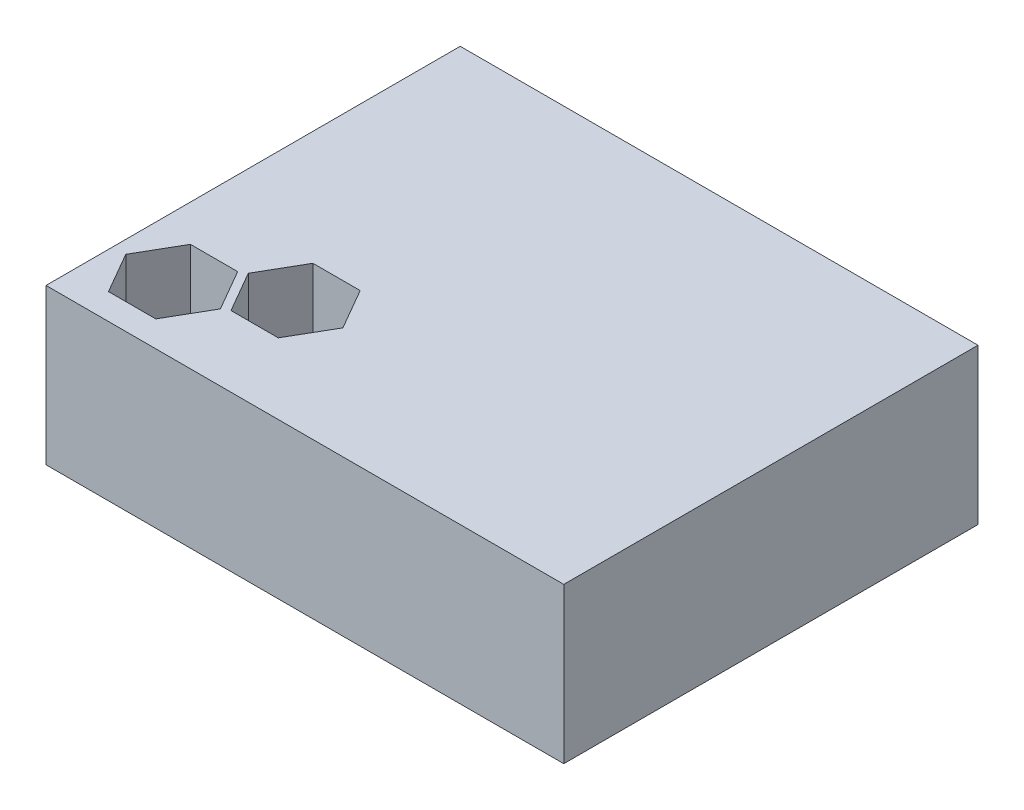
ISO-10303-21;
HEADER;
FILE_DESCRIPTION(('STEP AP214'),'2;1');
FILE_NAME('part.step','',(''),(''),'','','');
FILE_SCHEMA(('AUTOMOTIVE_DESIGN { 1 0 10303 214 1 1 1 1 }'));
ENDSEC;
DATA;
#1=APPLICATION_CONTEXT('core data for automotive mechanical design processes');
#2=APPLICATION_PROTOCOL_DEFINITION('international standard','automotive_design',2000,#1);
#3=PRODUCT_CONTEXT('',#1,'mechanical');
#4=PRODUCT('Part','Part','',(#3));
#5=PRODUCT_RELATED_PRODUCT_CATEGORY('part','',(#4));
#6=PRODUCT_DEFINITION_FORMATION('','',#4);
#7=PRODUCT_DEFINITION_CONTEXT('part definition',#1,'design');
#8=PRODUCT_DEFINITION('design','',#6,#7);
#9=PRODUCT_DEFINITION_SHAPE('','',#8);
#10=(LENGTH_UNIT() NAMED_UNIT(*) SI_UNIT(.MILLI.,.METRE.));
#11=(NAMED_UNIT(*) PLANE_ANGLE_UNIT() SI_UNIT($,.RADIAN.));
#12=(NAMED_UNIT(*) SI_UNIT($,.STERADIAN.) SOLID_ANGLE_UNIT());
#13=UNCERTAINTY_MEASURE_WITH_UNIT(LENGTH_MEASURE(1.E-05),#10,'distance_accuracy_value','');
#14=(GEOMETRIC_REPRESENTATION_CONTEXT(3) GLOBAL_UNCERTAINTY_ASSIGNED_CONTEXT((#13)) GLOBAL_UNIT_ASSIGNED_CONTEXT((#10,
#11,#12)) REPRESENTATION_CONTEXT('',''));
#15=CARTESIAN_POINT('',(0.,0.,0.));
#16=DIRECTION('',(0.,0.,1.));
#17=DIRECTION('',(1.,0.,0.));
#18=AXIS2_PLACEMENT_3D('',#15,#16,#17);
#19=CARTESIAN_POINT('',(0.,3.,0.));
#20=DIRECTION('',(1.,0.,0.));
#21=DIRECTION('',(0.,0.,-1.));
#22=AXIS2_PLACEMENT_3D('',#19,#20,#21);
#23=PLANE('',#22);
#24=DIRECTION('',(0.,0.,1.));
#25=VECTOR('',#24,1.);
#26=CARTESIAN_POINT('',(0.,0.,0.));
#27=LINE('',#26,#25);
#28=CARTESIAN_POINT('',(0.,0.,-8.));
#29=VERTEX_POINT('',#28);
#30=CARTESIAN_POINT('',(0.,0.,0.));
#31=VERTEX_POINT('',#30);
#32=EDGE_CURVE('E239',#29,#31,#27,.T.);
#33=ORIENTED_EDGE('',*,*,#32,.T.);
#34=DIRECTION('',(0.,-1.,0.));
#35=VECTOR('',#34,1.);
#36=CARTESIAN_POINT('',(0.,3.,0.));
#37=LINE('',#36,#35);
#38=CARTESIAN_POINT('',(0.,3.,0.));
#39=VERTEX_POINT('',#38);
#40=EDGE_CURVE('E11',#39,#31,#37,.T.);
#41=ORIENTED_EDGE('',*,*,#40,.F.);
#42=DIRECTION('',(0.,0.,1.));
#43=VECTOR('',#42,1.);
#44=CARTESIAN_POINT('',(0.,3.,0.));
#45=LINE('',#44,#43);
#46=CARTESIAN_POINT('',(0.,3.,-8.));
#47=VERTEX_POINT('',#46);
#48=EDGE_CURVE('E240',#47,#39,#45,.T.);
#49=ORIENTED_EDGE('',*,*,#48,.F.);
#50=DIRECTION('',(0.,-1.,0.));
#51=VECTOR('',#50,1.);
#52=CARTESIAN_POINT('',(0.,3.,-8.));
#53=LINE('',#52,#51);
#54=EDGE_CURVE('E250',#47,#29,#53,.T.);
#55=ORIENTED_EDGE('',*,*,#54,.T.);
#56=EDGE_LOOP('',(#33,#41,#49,#55));
#57=FACE_BOUND('',#56,.T.);
#58=ADVANCED_FACE('F34',(#57),#23,.F.);
#59=CARTESIAN_POINT('',(0.,3.,0.));
#60=DIRECTION('',(0.,0.,-1.));
#61=DIRECTION('',(-1.,0.,0.));
#62=AXIS2_PLACEMENT_3D('',#59,#60,#61);
#63=PLANE('',#62);
#64=DIRECTION('',(1.,0.,0.));
#65=VECTOR('',#64,1.);
#66=CARTESIAN_POINT('',(0.,0.,0.));
#67=LINE('',#66,#65);
#68=CARTESIAN_POINT('',(10.,0.,0.));
#69=VERTEX_POINT('',#68);
#70=EDGE_CURVE('E253',#31,#69,#67,.T.);
#71=ORIENTED_EDGE('',*,*,#70,.T.);
#72=DIRECTION('',(0.,-1.,0.));
#73=VECTOR('',#72,1.);
#74=CARTESIAN_POINT('',(10.,3.,0.));
#75=LINE('',#74,#73);
#76=CARTESIAN_POINT('',(10.,3.,0.));
#77=VERTEX_POINT('',#76);
#78=EDGE_CURVE('E41',#77,#69,#75,.T.);
#79=ORIENTED_EDGE('',*,*,#78,.F.);
#80=DIRECTION('',(1.,0.,0.));
#81=VECTOR('',#80,1.);
#82=CARTESIAN_POINT('',(0.,3.,0.));
#83=LINE('',#82,#81);
#84=EDGE_CURVE('E243',#39,#77,#83,.T.);
#85=ORIENTED_EDGE('',*,*,#84,.F.);
#86=ORIENTED_EDGE('',*,*,#40,.T.);
#87=EDGE_LOOP('',(#71,#79,#85,#86));
#88=FACE_BOUND('',#87,.T.);
#89=ADVANCED_FACE('F282',(#88),#63,.F.);
#90=CARTESIAN_POINT('',(10.,3.,0.));
#91=DIRECTION('',(-1.,0.,0.));
#92=DIRECTION('',(0.,0.,1.));
#93=AXIS2_PLACEMENT_3D('',#90,#91,#92);
#94=PLANE('',#93);
#95=DIRECTION('',(0.,0.,-1.));
#96=VECTOR('',#95,1.);
#97=CARTESIAN_POINT('',(10.,0.,0.));
#98=LINE('',#97,#96);
#99=CARTESIAN_POINT('',(10.,0.,-8.));
#100=VERTEX_POINT('',#99);
#101=EDGE_CURVE('E255',#69,#100,#98,.T.);
#102=ORIENTED_EDGE('',*,*,#101,.T.);
#103=DIRECTION('',(0.,-1.,0.));
#104=VECTOR('',#103,1.);
#105=CARTESIAN_POINT('',(10.,3.,-8.));
#106=LINE('',#105,#104);
#107=CARTESIAN_POINT('',(10.,3.,-8.));
#108=VERTEX_POINT('',#107);
#109=EDGE_CURVE('E260',#108,#100,#106,.T.);
#110=ORIENTED_EDGE('',*,*,#109,.F.);
#111=DIRECTION('',(0.,0.,-1.));
#112=VECTOR('',#111,1.);
#113=CARTESIAN_POINT('',(10.,3.,0.));
#114=LINE('',#113,#112);
#115=EDGE_CURVE('E246',#77,#108,#114,.T.);
#116=ORIENTED_EDGE('',*,*,#115,.F.);
#117=ORIENTED_EDGE('',*,*,#78,.T.);
#118=EDGE_LOOP('',(#102,#110,#116,#117));
#119=FACE_BOUND('',#118,.T.);
#120=ADVANCED_FACE('F267',(#119),#94,.F.);
#121=CARTESIAN_POINT('',(0.,3.,-8.));
#122=DIRECTION('',(0.,0.,1.));
#123=DIRECTION('',(1.,0.,0.));
#124=AXIS2_PLACEMENT_3D('',#121,#122,#123);
#125=PLANE('',#124);
#126=DIRECTION('',(-1.,0.,0.));
#127=VECTOR('',#126,1.);
#128=CARTESIAN_POINT('',(0.,0.,-8.));
#129=LINE('',#128,#127);
#130=EDGE_CURVE('E244',#100,#29,#129,.T.);
#131=ORIENTED_EDGE('',*,*,#130,.T.);
#132=ORIENTED_EDGE('',*,*,#54,.F.);
#133=DIRECTION('',(-1.,0.,0.));
#134=VECTOR('',#133,1.);
#135=CARTESIAN_POINT('',(0.,3.,-8.));
#136=LINE('',#135,#134);
#137=EDGE_CURVE('E248',#108,#47,#136,.T.);
#138=ORIENTED_EDGE('',*,*,#137,.F.);
#139=ORIENTED_EDGE('',*,*,#109,.T.);
#140=EDGE_LOOP('',(#131,#132,#138,#139));
#141=FACE_BOUND('',#140,.T.);
#142=ADVANCED_FACE('F275',(#141),#125,.F.);
#143=CARTESIAN_POINT('',(0.,3.,0.));
#144=DIRECTION('',(0.,-1.,0.));
#145=DIRECTION('',(0.,0.,-1.));
#146=AXIS2_PLACEMENT_3D('',#143,#144,#145);
#147=PLANE('',#146);
#148=DIRECTION('',(-0.5,0.,-0.866025403784439));
#149=VECTOR('',#148,1.);
#150=CARTESIAN_POINT('',(3.57679491924311,3.,-2.15705080756886));
#151=LINE('',#150,#149);
#152=CARTESIAN_POINT('',(3.57679491924311,3.,-2.15705080756886));
#153=VERTEX_POINT('',#152);
#154=CARTESIAN_POINT('',(3.12009618943233,3.,-2.9480762113533));
#155=VERTEX_POINT('',#154);
#156=EDGE_CURVE('E166',#153,#155,#151,.T.);
#157=ORIENTED_EDGE('',*,*,#156,.F.);
#158=DIRECTION('',(0.5,0.,-0.866025403784439));
#159=VECTOR('',#158,1.);
#160=CARTESIAN_POINT('',(3.12009618943233,3.,-1.36602540378443));
#161=LINE('',#160,#159);
#162=CARTESIAN_POINT('',(3.12009618943233,3.,-1.36602540378443));
#163=VERTEX_POINT('',#162);
#164=EDGE_CURVE('E48',#163,#153,#161,.T.);
#165=ORIENTED_EDGE('',*,*,#164,.F.);
#166=DIRECTION('',(1.,0.,0.));
#167=VECTOR('',#166,1.);
#168=CARTESIAN_POINT('',(2.20669872981078,3.,-1.36602540378443));
#169=LINE('',#168,#167);
#170=CARTESIAN_POINT('',(2.20669872981078,3.,-1.36602540378443));
#171=VERTEX_POINT('',#170);
#172=EDGE_CURVE('E158',#171,#163,#169,.T.);
#173=ORIENTED_EDGE('',*,*,#172,.F.);
#174=DIRECTION('',(0.5,0.,0.866025403784439));
#175=VECTOR('',#174,1.);
#176=CARTESIAN_POINT('',(1.75,3.,-2.15705080756886));
#177=LINE('',#176,#175);
#178=CARTESIAN_POINT('',(1.75,3.,-2.15705080756886));
#179=VERTEX_POINT('',#178);
#180=EDGE_CURVE('E179',#179,#171,#177,.T.);
#181=ORIENTED_EDGE('',*,*,#180,.F.);
#182=DIRECTION('',(-0.5,0.,0.866025403784439));
#183=VECTOR('',#182,1.);
#184=CARTESIAN_POINT('',(2.20669872981078,3.,-2.9480762113533));
#185=LINE('',#184,#183);
#186=CARTESIAN_POINT('',(2.20669872981078,3.,-2.9480762113533));
#187=VERTEX_POINT('',#186);
#188=EDGE_CURVE('E176',#187,#179,#185,.T.);
#189=ORIENTED_EDGE('',*,*,#188,.F.);
#190=DIRECTION('',(-1.,0.,0.));
#191=VECTOR('',#190,1.);
#192=CARTESIAN_POINT('',(3.12009618943233,3.,-2.9480762113533));
#193=LINE('',#192,#191);
#194=EDGE_CURVE('E173',#155,#187,#193,.T.);
#195=ORIENTED_EDGE('',*,*,#194,.F.);
#196=EDGE_LOOP('',(#157,#165,#173,#181,#189,#195));
#197=FACE_BOUND('',#196,.T.);
#198=DIRECTION('',(-0.5,0.,-0.866025403784439));
#199=VECTOR('',#198,1.);
#200=CARTESIAN_POINT('',(2.07679491924311,3.,-1.29102540378444));
#201=LINE('',#200,#199);
#202=CARTESIAN_POINT('',(2.07679491924311,3.,-1.29102540378444));
#203=VERTEX_POINT('',#202);
#204=CARTESIAN_POINT('',(1.62009618943233,3.,-2.08205080756887));
#205=VERTEX_POINT('',#204);
#206=EDGE_CURVE('E208',#203,#205,#201,.T.);
#207=ORIENTED_EDGE('',*,*,#206,.F.);
#208=DIRECTION('',(0.5,0.,-0.866025403784439));
#209=VECTOR('',#208,1.);
#210=CARTESIAN_POINT('',(1.62009618943233,3.,-0.5));
#211=LINE('',#210,#209);
#212=CARTESIAN_POINT('',(1.62009618943233,3.,-0.5));
#213=VERTEX_POINT('',#212);
#214=EDGE_CURVE('E206',#213,#203,#211,.T.);
#215=ORIENTED_EDGE('',*,*,#214,.F.);
#216=DIRECTION('',(1.,0.,0.));
#217=VECTOR('',#216,1.);
#218=CARTESIAN_POINT('',(0.706698729810776,3.,-0.5));
#219=LINE('',#218,#217);
#220=CARTESIAN_POINT('',(0.706698729810776,3.,-0.5));
#221=VERTEX_POINT('',#220);
#222=EDGE_CURVE('E220',#221,#213,#219,.T.);
#223=ORIENTED_EDGE('',*,*,#222,.F.);
#224=DIRECTION('',(0.5,0.,0.866025403784439));
#225=VECTOR('',#224,1.);
#226=CARTESIAN_POINT('',(0.25,3.,-1.29102540378444));
#227=LINE('',#226,#225);
#228=CARTESIAN_POINT('',(0.25,3.,-1.29102540378444));
#229=VERTEX_POINT('',#228);
#230=EDGE_CURVE('E217',#229,#221,#227,.T.);
#231=ORIENTED_EDGE('',*,*,#230,.F.);
#232=DIRECTION('',(-0.5,0.,0.866025403784439));
#233=VECTOR('',#232,1.);
#234=CARTESIAN_POINT('',(0.706698729810777,3.,-2.08205080756887));
#235=LINE('',#234,#233);
#236=CARTESIAN_POINT('',(0.706698729810777,3.,-2.08205080756887));
#237=VERTEX_POINT('',#236);
#238=EDGE_CURVE('E214',#237,#229,#235,.T.);
#239=ORIENTED_EDGE('',*,*,#238,.F.);
#240=DIRECTION('',(-1.,0.,0.));
#241=VECTOR('',#240,1.);
#242=CARTESIAN_POINT('',(1.62009618943233,3.,-2.08205080756887));
#243=LINE('',#242,#241);
#244=EDGE_CURVE('E211',#205,#237,#243,.T.);
#245=ORIENTED_EDGE('',*,*,#244,.F.);
#246=EDGE_LOOP('',(#207,#215,#223,#231,#239,#245));
#247=FACE_BOUND('',#246,.T.);
#248=ORIENTED_EDGE('',*,*,#48,.T.);
#249=ORIENTED_EDGE('',*,*,#84,.T.);
#250=ORIENTED_EDGE('',*,*,#115,.T.);
#251=ORIENTED_EDGE('',*,*,#137,.T.);
#252=EDGE_LOOP('',(#248,#249,#250,#251));
#253=FACE_BOUND('',#252,.T.);
#254=ADVANCED_FACE('F281',(#197,#247,#253),#147,.F.);
#255=CARTESIAN_POINT('',(0.,0.,0.));
#256=DIRECTION('',(0.,-1.,0.));
#257=DIRECTION('',(0.,0.,-1.));
#258=AXIS2_PLACEMENT_3D('',#255,#256,#257);
#259=PLANE('',#258);
#260=DIRECTION('',(0.5,0.,-0.866025403784439));
#261=VECTOR('',#260,1.);
#262=CARTESIAN_POINT('',(3.12009618943233,0.,-1.36602540378443));
#263=LINE('',#262,#261);
#264=CARTESIAN_POINT('',(3.12009618943233,0.,-1.36602540378443));
#265=VERTEX_POINT('',#264);
#266=CARTESIAN_POINT('',(3.57679491924311,0.,-2.15705080756886));
#267=VERTEX_POINT('',#266);
#268=EDGE_CURVE('E156',#265,#267,#263,.T.);
#269=ORIENTED_EDGE('',*,*,#268,.T.);
#270=DIRECTION('',(-0.5,0.,-0.866025403784439));
#271=VECTOR('',#270,1.);
#272=CARTESIAN_POINT('',(3.57679491924311,0.,-2.15705080756886));
#273=LINE('',#272,#271);
#274=CARTESIAN_POINT('',(3.12009618943233,0.,-2.9480762113533));
#275=VERTEX_POINT('',#274);
#276=EDGE_CURVE('E145',#267,#275,#273,.T.);
#277=ORIENTED_EDGE('',*,*,#276,.T.);
#278=DIRECTION('',(-1.,0.,0.));
#279=VECTOR('',#278,1.);
#280=CARTESIAN_POINT('',(3.12009618943233,0.,-2.9480762113533));
#281=LINE('',#280,#279);
#282=CARTESIAN_POINT('',(2.20669872981078,0.,-2.9480762113533));
#283=VERTEX_POINT('',#282);
#284=EDGE_CURVE('E350',#275,#283,#281,.T.);
#285=ORIENTED_EDGE('',*,*,#284,.T.);
#286=DIRECTION('',(-0.5,0.,0.866025403784439));
#287=VECTOR('',#286,1.);
#288=CARTESIAN_POINT('',(2.20669872981078,0.,-2.9480762113533));
#289=LINE('',#288,#287);
#290=CARTESIAN_POINT('',(1.75,0.,-2.15705080756886));
#291=VERTEX_POINT('',#290);
#292=EDGE_CURVE('E352',#283,#291,#289,.T.);
#293=ORIENTED_EDGE('',*,*,#292,.T.);
#294=DIRECTION('',(0.5,0.,0.866025403784439));
#295=VECTOR('',#294,1.);
#296=CARTESIAN_POINT('',(1.75,0.,-2.15705080756886));
#297=LINE('',#296,#295);
#298=CARTESIAN_POINT('',(2.20669872981078,0.,-1.36602540378443));
#299=VERTEX_POINT('',#298);
#300=EDGE_CURVE('E168',#291,#299,#297,.T.);
#301=ORIENTED_EDGE('',*,*,#300,.T.);
#302=DIRECTION('',(1.,0.,0.));
#303=VECTOR('',#302,1.);
#304=CARTESIAN_POINT('',(2.20669872981078,0.,-1.36602540378443));
#305=LINE('',#304,#303);
#306=EDGE_CURVE('E164',#299,#265,#305,.T.);
#307=ORIENTED_EDGE('',*,*,#306,.T.);
#308=EDGE_LOOP('',(#269,#277,#285,#293,#301,#307));
#309=FACE_BOUND('',#308,.T.);
#310=DIRECTION('',(0.5,0.,-0.866025403784439));
#311=VECTOR('',#310,1.);
#312=CARTESIAN_POINT('',(1.62009618943233,0.,-0.5));
#313=LINE('',#312,#311);
#314=CARTESIAN_POINT('',(1.62009618943233,0.,-0.5));
#315=VERTEX_POINT('',#314);
#316=CARTESIAN_POINT('',(2.07679491924311,0.,-1.29102540378444));
#317=VERTEX_POINT('',#316);
#318=EDGE_CURVE('E203',#315,#317,#313,.T.);
#319=ORIENTED_EDGE('',*,*,#318,.T.);
#320=DIRECTION('',(-0.5,0.,-0.866025403784439));
#321=VECTOR('',#320,1.);
#322=CARTESIAN_POINT('',(2.07679491924311,0.,-1.29102540378444));
#323=LINE('',#322,#321);
#324=CARTESIAN_POINT('',(1.62009618943233,0.,-2.08205080756887));
#325=VERTEX_POINT('',#324);
#326=EDGE_CURVE('E226',#317,#325,#323,.T.);
#327=ORIENTED_EDGE('',*,*,#326,.T.);
#328=DIRECTION('',(-1.,0.,0.));
#329=VECTOR('',#328,1.);
#330=CARTESIAN_POINT('',(1.62009618943233,0.,-2.08205080756887));
#331=LINE('',#330,#329);
#332=CARTESIAN_POINT('',(0.706698729810777,0.,-2.08205080756887));
#333=VERTEX_POINT('',#332);
#334=EDGE_CURVE('E152',#325,#333,#331,.T.);
#335=ORIENTED_EDGE('',*,*,#334,.T.);
#336=DIRECTION('',(-0.5,0.,0.866025403784439));
#337=VECTOR('',#336,1.);
#338=CARTESIAN_POINT('',(0.706698729810777,0.,-2.08205080756887));
#339=LINE('',#338,#337);
#340=CARTESIAN_POINT('',(0.25,0.,-1.29102540378444));
#341=VERTEX_POINT('',#340);
#342=EDGE_CURVE('E194',#333,#341,#339,.T.);
#343=ORIENTED_EDGE('',*,*,#342,.T.);
#344=DIRECTION('',(0.5,0.,0.866025403784439));
#345=VECTOR('',#344,1.);
#346=CARTESIAN_POINT('',(0.25,0.,-1.29102540378444));
#347=LINE('',#346,#345);
#348=CARTESIAN_POINT('',(0.706698729810776,0.,-0.5));
#349=VERTEX_POINT('',#348);
#350=EDGE_CURVE('E197',#341,#349,#347,.T.);
#351=ORIENTED_EDGE('',*,*,#350,.T.);
#352=DIRECTION('',(1.,0.,0.));
#353=VECTOR('',#352,1.);
#354=CARTESIAN_POINT('',(0.706698729810776,0.,-0.5));
#355=LINE('',#354,#353);
#356=EDGE_CURVE('E200',#349,#315,#355,.T.);
#357=ORIENTED_EDGE('',*,*,#356,.T.);
#358=EDGE_LOOP('',(#319,#327,#335,#343,#351,#357));
#359=FACE_BOUND('',#358,.T.);
#360=ORIENTED_EDGE('',*,*,#32,.F.);
#361=ORIENTED_EDGE('',*,*,#130,.F.);
#362=ORIENTED_EDGE('',*,*,#101,.F.);
#363=ORIENTED_EDGE('',*,*,#70,.F.);
#364=EDGE_LOOP('',(#360,#361,#362,#363));
#365=FACE_BOUND('',#364,.T.);
#366=ADVANCED_FACE('F161',(#309,#359,#365),#259,.T.);
#367=CARTESIAN_POINT('',(1.62009618943233,-0.00100000000000013,-0.5));
#368=DIRECTION('',(0.866025403784439,0.,0.5));
#369=DIRECTION('',(0.5,0.,-0.866025403784439));
#370=AXIS2_PLACEMENT_3D('',#367,#368,#369);
#371=PLANE('',#370);
#372=DIRECTION('',(0.,1.,0.));
#373=VECTOR('',#372,1.);
#374=CARTESIAN_POINT('',(1.62009618943233,-0.00100000000000013,-0.5));
#375=LINE('',#374,#373);
#376=EDGE_CURVE('E224',#315,#213,#375,.T.);
#377=ORIENTED_EDGE('',*,*,#376,.T.);
#378=ORIENTED_EDGE('',*,*,#214,.T.);
#379=DIRECTION('',(0.,1.,0.));
#380=VECTOR('',#379,1.);
#381=CARTESIAN_POINT('',(2.07679491924311,-0.00100000000000013,-1.29102540378444));
#382=LINE('',#381,#380);
#383=EDGE_CURVE('E223',#317,#203,#382,.T.);
#384=ORIENTED_EDGE('',*,*,#383,.F.);
#385=ORIENTED_EDGE('',*,*,#318,.F.);
#386=EDGE_LOOP('',(#377,#378,#384,#385));
#387=FACE_BOUND('',#386,.T.);
#388=ADVANCED_FACE('F294',(#387),#371,.F.);
#389=CARTESIAN_POINT('',(0.706698729810776,-0.00100000000000013,-0.5));
#390=DIRECTION('',(0.,0.,1.));
#391=DIRECTION('',(1.,0.,0.));
#392=AXIS2_PLACEMENT_3D('',#389,#390,#391);
#393=PLANE('',#392);
#394=DIRECTION('',(0.,1.,0.));
#395=VECTOR('',#394,1.);
#396=CARTESIAN_POINT('',(0.706698729810776,-0.00100000000000013,-0.5));
#397=LINE('',#396,#395);
#398=EDGE_CURVE('E227',#349,#221,#397,.T.);
#399=ORIENTED_EDGE('',*,*,#398,.T.);
#400=ORIENTED_EDGE('',*,*,#222,.T.);
#401=ORIENTED_EDGE('',*,*,#376,.F.);
#402=ORIENTED_EDGE('',*,*,#356,.F.);
#403=EDGE_LOOP('',(#399,#400,#401,#402));
#404=FACE_BOUND('',#403,.T.);
#405=ADVANCED_FACE('F300',(#404),#393,.F.);
#406=CARTESIAN_POINT('',(0.25,-0.00100000000000013,-1.29102540378444));
#407=DIRECTION('',(-0.866025403784439,0.,0.5));
#408=DIRECTION('',(0.5,0.,0.866025403784439));
#409=AXIS2_PLACEMENT_3D('',#406,#407,#408);
#410=PLANE('',#409);
#411=DIRECTION('',(0.,1.,0.));
#412=VECTOR('',#411,1.);
#413=CARTESIAN_POINT('',(0.25,-0.00100000000000013,-1.29102540378444));
#414=LINE('',#413,#412);
#415=EDGE_CURVE('E229',#341,#229,#414,.T.);
#416=ORIENTED_EDGE('',*,*,#415,.T.);
#417=ORIENTED_EDGE('',*,*,#230,.T.);
#418=ORIENTED_EDGE('',*,*,#398,.F.);
#419=ORIENTED_EDGE('',*,*,#350,.F.);
#420=EDGE_LOOP('',(#416,#417,#418,#419));
#421=FACE_BOUND('',#420,.T.);
#422=ADVANCED_FACE('F313',(#421),#410,.F.);
#423=CARTESIAN_POINT('',(0.706698729810777,-0.00100000000000013,-2.08205080756887));
#424=DIRECTION('',(-0.866025403784439,0.,-0.5));
#425=DIRECTION('',(-0.5,0.,0.866025403784439));
#426=AXIS2_PLACEMENT_3D('',#423,#424,#425);
#427=PLANE('',#426);
#428=DIRECTION('',(0.,1.,0.));
#429=VECTOR('',#428,1.);
#430=CARTESIAN_POINT('',(0.706698729810777,-0.00100000000000013,-2.08205080756887));
#431=LINE('',#430,#429);
#432=EDGE_CURVE('E231',#333,#237,#431,.T.);
#433=ORIENTED_EDGE('',*,*,#432,.T.);
#434=ORIENTED_EDGE('',*,*,#238,.T.);
#435=ORIENTED_EDGE('',*,*,#415,.F.);
#436=ORIENTED_EDGE('',*,*,#342,.F.);
#437=EDGE_LOOP('',(#433,#434,#435,#436));
#438=FACE_BOUND('',#437,.T.);
#439=ADVANCED_FACE('F309',(#438),#427,.F.);
#440=CARTESIAN_POINT('',(1.62009618943233,-0.00100000000000013,-2.08205080756887));
#441=DIRECTION('',(0.,0.,-1.));
#442=DIRECTION('',(-1.,0.,0.));
#443=AXIS2_PLACEMENT_3D('',#440,#441,#442);
#444=PLANE('',#443);
#445=DIRECTION('',(0.,1.,0.));
#446=VECTOR('',#445,1.);
#447=CARTESIAN_POINT('',(1.62009618943233,-0.00100000000000013,-2.08205080756887));
#448=LINE('',#447,#446);
#449=EDGE_CURVE('E233',#325,#205,#448,.T.);
#450=ORIENTED_EDGE('',*,*,#449,.T.);
#451=ORIENTED_EDGE('',*,*,#244,.T.);
#452=ORIENTED_EDGE('',*,*,#432,.F.);
#453=ORIENTED_EDGE('',*,*,#334,.F.);
#454=EDGE_LOOP('',(#450,#451,#452,#453));
#455=FACE_BOUND('',#454,.T.);
#456=ADVANCED_FACE('F305',(#455),#444,.F.);
#457=CARTESIAN_POINT('',(2.07679491924311,-0.00100000000000013,-1.29102540378444));
#458=DIRECTION('',(0.866025403784439,0.,-0.5));
#459=DIRECTION('',(-0.5,0.,-0.866025403784439));
#460=AXIS2_PLACEMENT_3D('',#457,#458,#459);
#461=PLANE('',#460);
#462=ORIENTED_EDGE('',*,*,#383,.T.);
#463=ORIENTED_EDGE('',*,*,#206,.T.);
#464=ORIENTED_EDGE('',*,*,#449,.F.);
#465=ORIENTED_EDGE('',*,*,#326,.F.);
#466=EDGE_LOOP('',(#462,#463,#464,#465));
#467=FACE_BOUND('',#466,.T.);
#468=ADVANCED_FACE('F302',(#467),#461,.F.);
#469=CARTESIAN_POINT('',(3.12009618943233,-0.00100000000000013,-1.36602540378443));
#470=DIRECTION('',(0.866025403784439,0.,0.5));
#471=DIRECTION('',(0.5,0.,-0.866025403784439));
#472=AXIS2_PLACEMENT_3D('',#469,#470,#471);
#473=PLANE('',#472);
#474=DIRECTION('',(0.,1.,0.));
#475=VECTOR('',#474,1.);
#476=CARTESIAN_POINT('',(3.12009618943233,-0.00100000000000013,-1.36602540378443));
#477=LINE('',#476,#475);
#478=EDGE_CURVE('E153',#265,#163,#477,.T.);
#479=ORIENTED_EDGE('',*,*,#478,.T.);
#480=ORIENTED_EDGE('',*,*,#164,.T.);
#481=DIRECTION('',(0.,1.,0.));
#482=VECTOR('',#481,1.);
#483=CARTESIAN_POINT('',(3.57679491924311,-0.00100000000000013,-2.15705080756886));
#484=LINE('',#483,#482);
#485=EDGE_CURVE('E147',#267,#153,#484,.T.);
#486=ORIENTED_EDGE('',*,*,#485,.F.);
#487=ORIENTED_EDGE('',*,*,#268,.F.);
#488=EDGE_LOOP('',(#479,#480,#486,#487));
#489=FACE_BOUND('',#488,.T.);
#490=ADVANCED_FACE('F155',(#489),#473,.F.);
#491=CARTESIAN_POINT('',(2.20669872981078,-0.00100000000000013,-1.36602540378443));
#492=DIRECTION('',(0.,0.,1.));
#493=DIRECTION('',(1.,0.,0.));
#494=AXIS2_PLACEMENT_3D('',#491,#492,#493);
#495=PLANE('',#494);
#496=DIRECTION('',(0.,1.,0.));
#497=VECTOR('',#496,1.);
#498=CARTESIAN_POINT('',(2.20669872981078,-0.00100000000000013,-1.36602540378443));
#499=LINE('',#498,#497);
#500=EDGE_CURVE('E185',#299,#171,#499,.T.);
#501=ORIENTED_EDGE('',*,*,#500,.T.);
#502=ORIENTED_EDGE('',*,*,#172,.T.);
#503=ORIENTED_EDGE('',*,*,#478,.F.);
#504=ORIENTED_EDGE('',*,*,#306,.F.);
#505=EDGE_LOOP('',(#501,#502,#503,#504));
#506=FACE_BOUND('',#505,.T.);
#507=ADVANCED_FACE('F323',(#506),#495,.F.);
#508=CARTESIAN_POINT('',(1.75,-0.00100000000000013,-2.15705080756886));
#509=DIRECTION('',(-0.866025403784439,0.,0.5));
#510=DIRECTION('',(0.5,0.,0.866025403784439));
#511=AXIS2_PLACEMENT_3D('',#508,#509,#510);
#512=PLANE('',#511);
#513=DIRECTION('',(0.,1.,0.));
#514=VECTOR('',#513,1.);
#515=CARTESIAN_POINT('',(1.75,-0.00100000000000013,-2.15705080756886));
#516=LINE('',#515,#514);
#517=EDGE_CURVE('E187',#291,#179,#516,.T.);
#518=ORIENTED_EDGE('',*,*,#517,.T.);
#519=ORIENTED_EDGE('',*,*,#180,.T.);
#520=ORIENTED_EDGE('',*,*,#500,.F.);
#521=ORIENTED_EDGE('',*,*,#300,.F.);
#522=EDGE_LOOP('',(#518,#519,#520,#521));
#523=FACE_BOUND('',#522,.T.);
#524=ADVANCED_FACE('F333',(#523),#512,.F.);
#525=CARTESIAN_POINT('',(2.20669872981078,-0.00100000000000013,-2.9480762113533));
#526=DIRECTION('',(-0.866025403784439,0.,-0.5));
#527=DIRECTION('',(-0.5,0.,0.866025403784439));
#528=AXIS2_PLACEMENT_3D('',#525,#526,#527);
#529=PLANE('',#528);
#530=DIRECTION('',(0.,1.,0.));
#531=VECTOR('',#530,1.);
#532=CARTESIAN_POINT('',(2.20669872981078,-0.00100000000000013,-2.9480762113533));
#533=LINE('',#532,#531);
#534=EDGE_CURVE('E189',#283,#187,#533,.T.);
#535=ORIENTED_EDGE('',*,*,#534,.T.);
#536=ORIENTED_EDGE('',*,*,#188,.T.);
#537=ORIENTED_EDGE('',*,*,#517,.F.);
#538=ORIENTED_EDGE('',*,*,#292,.F.);
#539=EDGE_LOOP('',(#535,#536,#537,#538));
#540=FACE_BOUND('',#539,.T.);
#541=ADVANCED_FACE('F329',(#540),#529,.F.);
#542=CARTESIAN_POINT('',(3.12009618943233,-0.00100000000000013,-2.9480762113533));
#543=DIRECTION('',(0.,0.,-1.));
#544=DIRECTION('',(-1.,0.,0.));
#545=AXIS2_PLACEMENT_3D('',#542,#543,#544);
#546=PLANE('',#545);
#547=DIRECTION('',(0.,1.,0.));
#548=VECTOR('',#547,1.);
#549=CARTESIAN_POINT('',(3.12009618943233,-0.00100000000000013,-2.9480762113533));
#550=LINE('',#549,#548);
#551=EDGE_CURVE('E56',#275,#155,#550,.T.);
#552=ORIENTED_EDGE('',*,*,#551,.T.);
#553=ORIENTED_EDGE('',*,*,#194,.T.);
#554=ORIENTED_EDGE('',*,*,#534,.F.);
#555=ORIENTED_EDGE('',*,*,#284,.F.);
#556=EDGE_LOOP('',(#552,#553,#554,#555));
#557=FACE_BOUND('',#556,.T.);
#558=ADVANCED_FACE('F326',(#557),#546,.F.);
#559=CARTESIAN_POINT('',(3.57679491924311,-0.00100000000000013,-2.15705080756886));
#560=DIRECTION('',(0.866025403784439,0.,-0.5));
#561=DIRECTION('',(-0.5,0.,-0.866025403784439));
#562=AXIS2_PLACEMENT_3D('',#559,#560,#561);
#563=PLANE('',#562);
#564=ORIENTED_EDGE('',*,*,#485,.T.);
#565=ORIENTED_EDGE('',*,*,#156,.T.);
#566=ORIENTED_EDGE('',*,*,#551,.F.);
#567=ORIENTED_EDGE('',*,*,#276,.F.);
#568=EDGE_LOOP('',(#564,#565,#566,#567));
#569=FACE_BOUND('',#568,.T.);
#570=ADVANCED_FACE('F146',(#569),#563,.F.);
#571=CLOSED_SHELL('',(#58,#89,#120,#142,#254,#366,#388,#405,#422,#439,#456,#468,#490,#507,#524,
#541,#558,#570));
#572=MANIFOLD_SOLID_BREP('B2',#571);
#573=ADVANCED_BREP_SHAPE_REPRESENTATION('',(#18,#572),#14);
#574=SHAPE_DEFINITION_REPRESENTATION(#9,#573);
ENDSEC;
END-ISO-10303-21;
